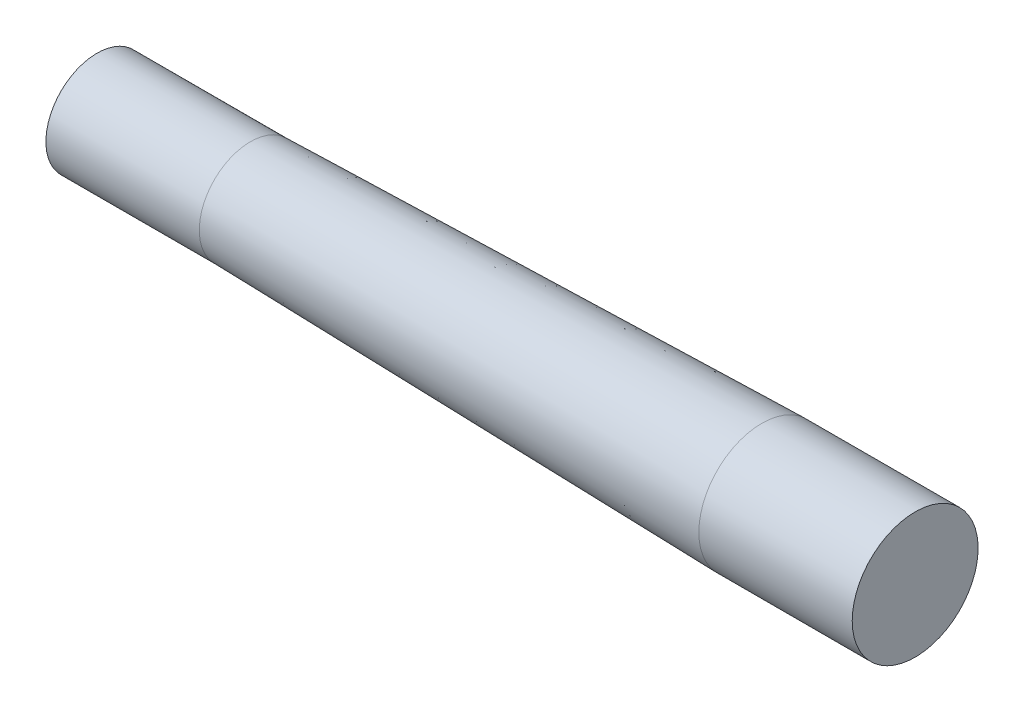
ISO-10303-21;
HEADER;
FILE_DESCRIPTION(('STEP AP214'),'2;1');
FILE_NAME('part.step','',(''),(''),'','','');
FILE_SCHEMA(('AUTOMOTIVE_DESIGN { 1 0 10303 214 1 1 1 1 }'));
ENDSEC;
DATA;
#1=APPLICATION_CONTEXT('core data for automotive mechanical design processes');
#2=APPLICATION_PROTOCOL_DEFINITION('international standard','automotive_design',2000,#1);
#3=PRODUCT_CONTEXT('',#1,'mechanical');
#4=PRODUCT('Part','Part','',(#3));
#5=PRODUCT_RELATED_PRODUCT_CATEGORY('part','',(#4));
#6=PRODUCT_DEFINITION_FORMATION('','',#4);
#7=PRODUCT_DEFINITION_CONTEXT('part definition',#1,'design');
#8=PRODUCT_DEFINITION('design','',#6,#7);
#9=PRODUCT_DEFINITION_SHAPE('','',#8);
#10=(LENGTH_UNIT() NAMED_UNIT(*) SI_UNIT(.MILLI.,.METRE.));
#11=(NAMED_UNIT(*) PLANE_ANGLE_UNIT() SI_UNIT($,.RADIAN.));
#12=(NAMED_UNIT(*) SI_UNIT($,.STERADIAN.) SOLID_ANGLE_UNIT());
#13=UNCERTAINTY_MEASURE_WITH_UNIT(LENGTH_MEASURE(1.E-05),#10,'distance_accuracy_value','');
#14=(GEOMETRIC_REPRESENTATION_CONTEXT(3) GLOBAL_UNCERTAINTY_ASSIGNED_CONTEXT((#13)) GLOBAL_UNIT_ASSIGNED_CONTEXT((#10,
#11,#12)) REPRESENTATION_CONTEXT('',''));
#15=CARTESIAN_POINT('',(0.,0.,0.));
#16=DIRECTION('',(0.,0.,1.));
#17=DIRECTION('',(1.,0.,0.));
#18=AXIS2_PLACEMENT_3D('',#15,#16,#17);
#19=CARTESIAN_POINT('',(0.,0.,0.));
#20=DIRECTION('',(1.,0.,0.));
#21=DIRECTION('',(0.,0.,-1.));
#22=AXIS2_PLACEMENT_3D('',#19,#20,#21);
#23=CONICAL_SURFACE('',#22,102.108,0.0231235660486341);
#24=CARTESIAN_POINT('',(0.,0.,0.));
#25=DIRECTION('',(-1.,0.,0.));
#26=DIRECTION('',(0.,0.,1.));
#27=AXIS2_PLACEMENT_3D('',#24,#25,#26);
#28=CIRCLE('',#27,102.108);
#29=CARTESIAN_POINT('',(0.,0.,-102.108));
#30=VERTEX_POINT('',#29);
#31=EDGE_CURVE('E46',#30,#30,#28,.T.);
#32=ORIENTED_EDGE('',*,*,#31,.F.);
#33=EDGE_LOOP('',(#32));
#34=FACE_BOUND('',#33,.T.);
#35=CARTESIAN_POINT('',(1021.37315576226,0.,0.));
#36=DIRECTION('',(1.,0.,0.));
#37=DIRECTION('',(0.,0.,-1.));
#38=AXIS2_PLACEMENT_3D('',#35,#36,#37);
#39=CIRCLE('',#38,125.73);
#40=CARTESIAN_POINT('',(1021.37315576226,0.,125.73));
#41=VERTEX_POINT('',#40);
#42=EDGE_CURVE('E11',#41,#41,#39,.T.);
#43=ORIENTED_EDGE('',*,*,#42,.F.);
#44=EDGE_LOOP('',(#43));
#45=FACE_BOUND('',#44,.T.);
#46=ADVANCED_FACE('F33',(#34,#45),#23,.T.);
#47=CARTESIAN_POINT('',(-306.324,0.,0.));
#48=DIRECTION('',(1.,0.,0.));
#49=DIRECTION('',(0.,0.,-1.));
#50=AXIS2_PLACEMENT_3D('',#47,#48,#49);
#51=CYLINDRICAL_SURFACE('',#50,102.108);
#52=CARTESIAN_POINT('',(-306.324,0.,0.));
#53=DIRECTION('',(-1.,0.,0.));
#54=DIRECTION('',(0.,0.,1.));
#55=AXIS2_PLACEMENT_3D('',#52,#53,#54);
#56=CIRCLE('',#55,102.108);
#57=CARTESIAN_POINT('',(-306.324,0.,-102.108));
#58=VERTEX_POINT('',#57);
#59=EDGE_CURVE('E41',#58,#58,#56,.T.);
#60=CARTESIAN_POINT('',(-306.324,0.,-102.108));
#61=CARTESIAN_POINT('',(-303.133125,0.,-102.108));
#62=CARTESIAN_POINT('',(-299.94225,0.,-102.108));
#63=CARTESIAN_POINT('',(-293.5605,0.,-102.108));
#64=CARTESIAN_POINT('',(-290.369625,0.,-102.108));
#65=CARTESIAN_POINT('',(-283.987875,0.,-102.108));
#66=CARTESIAN_POINT('',(-280.797,0.,-102.108));
#67=CARTESIAN_POINT('',(-274.41525,0.,-102.108));
#68=CARTESIAN_POINT('',(-271.224375,0.,-102.108));
#69=CARTESIAN_POINT('',(-264.842625,0.,-102.108));
#70=CARTESIAN_POINT('',(-261.65175,0.,-102.108));
#71=CARTESIAN_POINT('',(-255.27,0.,-102.108));
#72=CARTESIAN_POINT('',(-252.079125,0.,-102.108));
#73=CARTESIAN_POINT('',(-245.697375,0.,-102.108));
#74=CARTESIAN_POINT('',(-242.5065,0.,-102.108));
#75=CARTESIAN_POINT('',(-236.12475,0.,-102.108));
#76=CARTESIAN_POINT('',(-232.933875,0.,-102.108));
#77=CARTESIAN_POINT('',(-226.552125,0.,-102.108));
#78=CARTESIAN_POINT('',(-223.36125,0.,-102.108));
#79=CARTESIAN_POINT('',(-216.9795,0.,-102.108));
#80=CARTESIAN_POINT('',(-213.788625,0.,-102.108));
#81=CARTESIAN_POINT('',(-207.406875,0.,-102.108));
#82=CARTESIAN_POINT('',(-204.216,0.,-102.108));
#83=CARTESIAN_POINT('',(-197.83425,0.,-102.108));
#84=CARTESIAN_POINT('',(-194.643375,0.,-102.108));
#85=CARTESIAN_POINT('',(-188.261625,0.,-102.108));
#86=CARTESIAN_POINT('',(-185.07075,0.,-102.108));
#87=CARTESIAN_POINT('',(-178.689,0.,-102.108));
#88=CARTESIAN_POINT('',(-175.498125,0.,-102.108));
#89=CARTESIAN_POINT('',(-169.116375,0.,-102.108));
#90=CARTESIAN_POINT('',(-165.9255,0.,-102.108));
#91=CARTESIAN_POINT('',(-159.54375,0.,-102.108));
#92=CARTESIAN_POINT('',(-156.352875,0.,-102.108));
#93=CARTESIAN_POINT('',(-149.971125,0.,-102.108));
#94=CARTESIAN_POINT('',(-146.78025,0.,-102.108));
#95=CARTESIAN_POINT('',(-140.3985,0.,-102.108));
#96=CARTESIAN_POINT('',(-137.207625,0.,-102.108));
#97=CARTESIAN_POINT('',(-130.825875,0.,-102.108));
#98=CARTESIAN_POINT('',(-127.635,0.,-102.108));
#99=CARTESIAN_POINT('',(-121.25325,0.,-102.108));
#100=CARTESIAN_POINT('',(-118.062375,0.,-102.108));
#101=CARTESIAN_POINT('',(-111.680625,0.,-102.108));
#102=CARTESIAN_POINT('',(-108.48975,0.,-102.108));
#103=CARTESIAN_POINT('',(-102.108,0.,-102.108));
#104=CARTESIAN_POINT('',(-98.917125,0.,-102.108));
#105=CARTESIAN_POINT('',(-92.535375,0.,-102.108));
#106=CARTESIAN_POINT('',(-89.3445,0.,-102.108));
#107=CARTESIAN_POINT('',(-82.96275,0.,-102.108));
#108=CARTESIAN_POINT('',(-79.771875,0.,-102.108));
#109=CARTESIAN_POINT('',(-73.390125,0.,-102.108));
#110=CARTESIAN_POINT('',(-70.1992499999999,0.,-102.108));
#111=CARTESIAN_POINT('',(-63.8175,0.,-102.108));
#112=CARTESIAN_POINT('',(-60.626625,0.,-102.108));
#113=CARTESIAN_POINT('',(-54.244875,0.,-102.108));
#114=CARTESIAN_POINT('',(-51.054,0.,-102.108));
#115=CARTESIAN_POINT('',(-44.67225,0.,-102.108));
#116=CARTESIAN_POINT('',(-41.481375,0.,-102.108));
#117=CARTESIAN_POINT('',(-35.099625,0.,-102.108));
#118=CARTESIAN_POINT('',(-31.90875,0.,-102.108));
#119=CARTESIAN_POINT('',(-25.527,0.,-102.108));
#120=CARTESIAN_POINT('',(-22.336125,0.,-102.108));
#121=CARTESIAN_POINT('',(-15.954375,0.,-102.108));
#122=CARTESIAN_POINT('',(-12.7635,0.,-102.108));
#123=CARTESIAN_POINT('',(-6.38175,0.,-102.108));
#124=CARTESIAN_POINT('',(-3.190875,0.,-102.108));
#125=CARTESIAN_POINT('',(0.,0.,-102.108));
#126=B_SPLINE_CURVE_WITH_KNOTS('',3,(#60,#61,#62,#63,#64,#65,#66,#67,#68,#69,#70,#71,#72,#73,
#74,#75,#76,#77,#78,#79,#80,#81,#82,#83,#84,#85,#86,#87,#88,#89,#90,#91,#92,#93,#94,#95,#96,#97,
#98,#99,#100,#101,#102,#103,#104,#105,#106,#107,#108,#109,#110,#111,#112,#113,#114,#115,#116,
#117,#118,#119,#120,#121,#122,#123,#124,#125),.UNSPECIFIED.,.F.,.F.,(4,2,2,2,2,2,2,2,2,2,2,2,2,
2,2,2,2,2,2,2,2,2,2,2,2,2,2,2,2,2,2,2,4),(0.,9.572625,19.14525,28.717875,38.2905,47.863125,
57.43575,67.008375,76.581,86.153625,95.72625,105.298875,114.8715,124.444125,134.01675,
143.589375,153.162,162.734625,172.30725,181.879875,191.4525,201.025125,210.59775,220.170375,
229.743,239.315625,248.88825,258.460875,268.0335,277.606125,287.17875,296.751375,306.324),.UNSPECIFIED.);
#127=EDGE_CURVE('BSEAM82',#58,#30,#126,.T.);
#128=ORIENTED_EDGE('',*,*,#59,.F.);
#129=ORIENTED_EDGE('',*,*,#31,.T.);
#130=ORIENTED_EDGE('',*,*,#127,.T.);
#131=ORIENTED_EDGE('',*,*,#127,.F.);
#132=EDGE_LOOP('',(#128,#130,#129,#131));
#133=FACE_BOUND('',#132,.T.);
#134=ADVANCED_FACE('F82',(#133),#51,.T.);
#135=CARTESIAN_POINT('',(-306.324,0.,0.));
#136=DIRECTION('',(-1.,0.,0.));
#137=DIRECTION('',(0.,0.,1.));
#138=AXIS2_PLACEMENT_3D('',#135,#136,#137);
#139=PLANE('',#138);
#140=ORIENTED_EDGE('',*,*,#59,.T.);
#141=EDGE_LOOP('',(#140));
#142=FACE_BOUND('',#141,.T.);
#143=ADVANCED_FACE('F91',(#142),#139,.T.);
#144=CARTESIAN_POINT('',(1327.69715576226,0.,0.));
#145=DIRECTION('',(-1.,0.,0.));
#146=DIRECTION('',(0.,0.,1.));
#147=AXIS2_PLACEMENT_3D('',#144,#145,#146);
#148=CYLINDRICAL_SURFACE('',#147,125.73);
#149=CARTESIAN_POINT('',(1327.69715576226,0.,0.));
#150=DIRECTION('',(1.,0.,0.));
#151=DIRECTION('',(0.,0.,-1.));
#152=AXIS2_PLACEMENT_3D('',#149,#150,#151);
#153=CIRCLE('',#152,125.73);
#154=CARTESIAN_POINT('',(1327.69715576226,0.,125.73));
#155=VERTEX_POINT('',#154);
#156=EDGE_CURVE('E51',#155,#155,#153,.T.);
#157=CARTESIAN_POINT('',(1327.69715576226,0.,125.73));
#158=CARTESIAN_POINT('',(1324.50628076226,0.,125.73));
#159=CARTESIAN_POINT('',(1321.31540576226,0.,125.73));
#160=CARTESIAN_POINT('',(1314.93365576226,0.,125.73));
#161=CARTESIAN_POINT('',(1311.74278076226,0.,125.73));
#162=CARTESIAN_POINT('',(1305.36103076226,0.,125.73));
#163=CARTESIAN_POINT('',(1302.17015576226,0.,125.73));
#164=CARTESIAN_POINT('',(1295.78840576226,0.,125.73));
#165=CARTESIAN_POINT('',(1292.59753076226,0.,125.73));
#166=CARTESIAN_POINT('',(1286.21578076226,0.,125.73));
#167=CARTESIAN_POINT('',(1283.02490576226,0.,125.73));
#168=CARTESIAN_POINT('',(1276.64315576226,0.,125.73));
#169=CARTESIAN_POINT('',(1273.45228076226,0.,125.73));
#170=CARTESIAN_POINT('',(1267.07053076226,0.,125.73));
#171=CARTESIAN_POINT('',(1263.87965576226,0.,125.73));
#172=CARTESIAN_POINT('',(1257.49790576226,0.,125.73));
#173=CARTESIAN_POINT('',(1254.30703076226,0.,125.73));
#174=CARTESIAN_POINT('',(1247.92528076226,0.,125.73));
#175=CARTESIAN_POINT('',(1244.73440576226,0.,125.73));
#176=CARTESIAN_POINT('',(1238.35265576226,0.,125.73));
#177=CARTESIAN_POINT('',(1235.16178076226,0.,125.73));
#178=CARTESIAN_POINT('',(1228.78003076226,0.,125.73));
#179=CARTESIAN_POINT('',(1225.58915576226,0.,125.73));
#180=CARTESIAN_POINT('',(1219.20740576226,0.,125.73));
#181=CARTESIAN_POINT('',(1216.01653076226,0.,125.73));
#182=CARTESIAN_POINT('',(1209.63478076226,0.,125.73));
#183=CARTESIAN_POINT('',(1206.44390576226,0.,125.73));
#184=CARTESIAN_POINT('',(1200.06215576226,0.,125.73));
#185=CARTESIAN_POINT('',(1196.87128076226,0.,125.73));
#186=CARTESIAN_POINT('',(1190.48953076226,0.,125.73));
#187=CARTESIAN_POINT('',(1187.29865576226,0.,125.73));
#188=CARTESIAN_POINT('',(1180.91690576226,0.,125.73));
#189=CARTESIAN_POINT('',(1177.72603076226,0.,125.73));
#190=CARTESIAN_POINT('',(1171.34428076226,0.,125.73));
#191=CARTESIAN_POINT('',(1168.15340576226,0.,125.73));
#192=CARTESIAN_POINT('',(1161.77165576226,0.,125.73));
#193=CARTESIAN_POINT('',(1158.58078076226,0.,125.73));
#194=CARTESIAN_POINT('',(1152.19903076226,0.,125.73));
#195=CARTESIAN_POINT('',(1149.00815576226,0.,125.73));
#196=CARTESIAN_POINT('',(1142.62640576226,0.,125.73));
#197=CARTESIAN_POINT('',(1139.43553076226,0.,125.73));
#198=CARTESIAN_POINT('',(1133.05378076226,0.,125.73));
#199=CARTESIAN_POINT('',(1129.86290576226,0.,125.73));
#200=CARTESIAN_POINT('',(1123.48115576226,0.,125.73));
#201=CARTESIAN_POINT('',(1120.29028076226,0.,125.73));
#202=CARTESIAN_POINT('',(1113.90853076226,0.,125.73));
#203=CARTESIAN_POINT('',(1110.71765576226,0.,125.73));
#204=CARTESIAN_POINT('',(1104.33590576226,0.,125.73));
#205=CARTESIAN_POINT('',(1101.14503076226,0.,125.73));
#206=CARTESIAN_POINT('',(1094.76328076226,0.,125.73));
#207=CARTESIAN_POINT('',(1091.57240576226,0.,125.73));
#208=CARTESIAN_POINT('',(1085.19065576226,0.,125.73));
#209=CARTESIAN_POINT('',(1081.99978076226,0.,125.73));
#210=CARTESIAN_POINT('',(1075.61803076226,0.,125.73));
#211=CARTESIAN_POINT('',(1072.42715576226,0.,125.73));
#212=CARTESIAN_POINT('',(1066.04540576226,0.,125.73));
#213=CARTESIAN_POINT('',(1062.85453076226,0.,125.73));
#214=CARTESIAN_POINT('',(1056.47278076226,0.,125.73));
#215=CARTESIAN_POINT('',(1053.28190576226,0.,125.73));
#216=CARTESIAN_POINT('',(1046.90015576226,0.,125.73));
#217=CARTESIAN_POINT('',(1043.70928076226,0.,125.73));
#218=CARTESIAN_POINT('',(1037.32753076226,0.,125.73));
#219=CARTESIAN_POINT('',(1034.13665576226,0.,125.73));
#220=CARTESIAN_POINT('',(1027.75490576226,0.,125.73));
#221=CARTESIAN_POINT('',(1024.56403076226,0.,125.73));
#222=CARTESIAN_POINT('',(1021.37315576226,0.,125.73));
#223=B_SPLINE_CURVE_WITH_KNOTS('',3,(#157,#158,#159,#160,#161,#162,#163,#164,#165,#166,#167,
#168,#169,#170,#171,#172,#173,#174,#175,#176,#177,#178,#179,#180,#181,#182,#183,#184,#185,#186,
#187,#188,#189,#190,#191,#192,#193,#194,#195,#196,#197,#198,#199,#200,#201,#202,#203,#204,#205,
#206,#207,#208,#209,#210,#211,#212,#213,#214,#215,#216,#217,#218,#219,#220,#221,#222),
.UNSPECIFIED.,.F.,.F.,(4,2,2,2,2,2,2,2,2,2,2,2,2,2,2,2,2,2,2,2,2,2,2,2,2,2,2,2,2,2,2,2,4),(0.,
9.57262500000011,19.1452500000002,28.7178750000001,38.2905000000002,47.8631250000001,
57.4357500000002,67.0083750000001,76.5810000000002,86.1536250000001,95.7262500000002,105.298875,
114.8715,124.444125,134.01675,143.589375,153.162,162.734625,172.30725,181.879875,191.4525,
201.025125,210.59775,220.170375,229.743,239.315625,248.88825,258.460875,268.0335,277.606125,
287.17875,296.751375,306.324),.UNSPECIFIED.);
#224=EDGE_CURVE('BSEAM95',#155,#41,#223,.T.);
#225=ORIENTED_EDGE('',*,*,#156,.F.);
#226=ORIENTED_EDGE('',*,*,#42,.T.);
#227=ORIENTED_EDGE('',*,*,#224,.T.);
#228=ORIENTED_EDGE('',*,*,#224,.F.);
#229=EDGE_LOOP('',(#225,#227,#226,#228));
#230=FACE_BOUND('',#229,.T.);
#231=ADVANCED_FACE('F95',(#230),#148,.T.);
#232=CARTESIAN_POINT('',(1327.69715576226,0.,0.));
#233=DIRECTION('',(1.,0.,0.));
#234=DIRECTION('',(0.,0.,-1.));
#235=AXIS2_PLACEMENT_3D('',#232,#233,#234);
#236=PLANE('',#235);
#237=ORIENTED_EDGE('',*,*,#156,.T.);
#238=EDGE_LOOP('',(#237));
#239=FACE_BOUND('',#238,.T.);
#240=ADVANCED_FACE('F99',(#239),#236,.T.);
#241=CLOSED_SHELL('',(#46,#134,#143,#231,#240));
#242=MANIFOLD_SOLID_BREP('B2',#241);
#243=ADVANCED_BREP_SHAPE_REPRESENTATION('',(#18,#242),#14);
#244=SHAPE_DEFINITION_REPRESENTATION(#9,#243);
ENDSEC;
END-ISO-10303-21;
